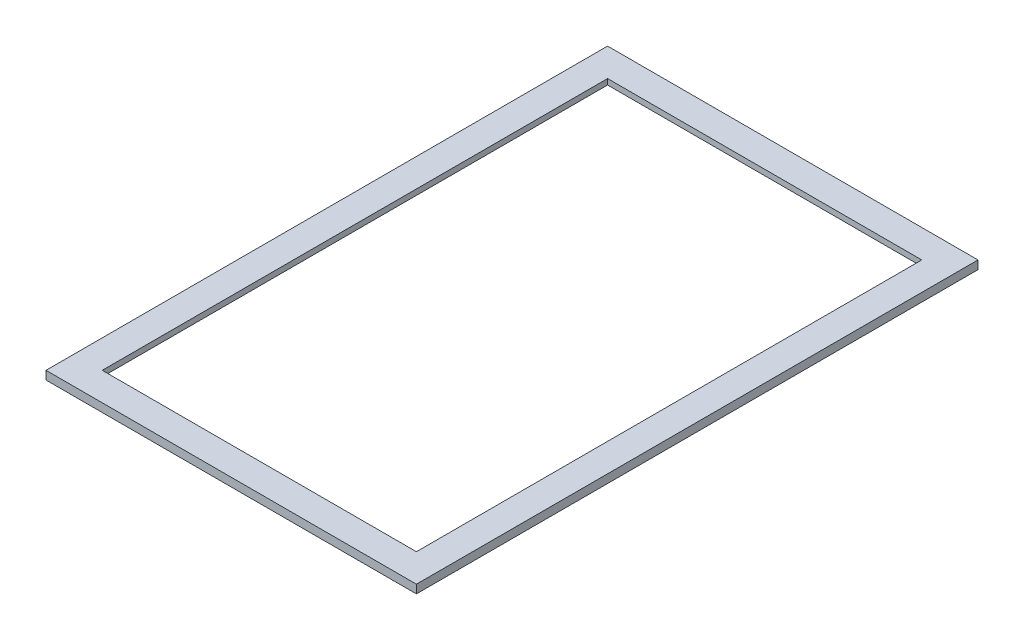
ISO-10303-21;
HEADER;
FILE_DESCRIPTION(('STEP AP214'),'2;1');
FILE_NAME('part.step','',(''),(''),'','','');
FILE_SCHEMA(('AUTOMOTIVE_DESIGN { 1 0 10303 214 1 1 1 1 }'));
ENDSEC;
DATA;
#1=APPLICATION_CONTEXT('core data for automotive mechanical design processes');
#2=APPLICATION_PROTOCOL_DEFINITION('international standard','automotive_design',2000,#1);
#3=PRODUCT_CONTEXT('',#1,'mechanical');
#4=PRODUCT('Part','Part','',(#3));
#5=PRODUCT_RELATED_PRODUCT_CATEGORY('part','',(#4));
#6=PRODUCT_DEFINITION_FORMATION('','',#4);
#7=PRODUCT_DEFINITION_CONTEXT('part definition',#1,'design');
#8=PRODUCT_DEFINITION('design','',#6,#7);
#9=PRODUCT_DEFINITION_SHAPE('','',#8);
#10=(LENGTH_UNIT() NAMED_UNIT(*) SI_UNIT(.MILLI.,.METRE.));
#11=(NAMED_UNIT(*) PLANE_ANGLE_UNIT() SI_UNIT($,.RADIAN.));
#12=(NAMED_UNIT(*) SI_UNIT($,.STERADIAN.) SOLID_ANGLE_UNIT());
#13=UNCERTAINTY_MEASURE_WITH_UNIT(LENGTH_MEASURE(1.E-05),#10,'distance_accuracy_value','');
#14=(GEOMETRIC_REPRESENTATION_CONTEXT(3) GLOBAL_UNCERTAINTY_ASSIGNED_CONTEXT((#13)) GLOBAL_UNIT_ASSIGNED_CONTEXT((#10,
#11,#12)) REPRESENTATION_CONTEXT('',''));
#15=CARTESIAN_POINT('',(0.,0.,0.));
#16=DIRECTION('',(0.,0.,1.));
#17=DIRECTION('',(1.,0.,0.));
#18=AXIS2_PLACEMENT_3D('',#15,#16,#17);
#19=CARTESIAN_POINT('',(65.875,3.,99.875));
#20=DIRECTION('',(-1.,0.,0.));
#21=DIRECTION('',(0.,0.,1.));
#22=AXIS2_PLACEMENT_3D('',#19,#20,#21);
#23=PLANE('',#22);
#24=DIRECTION('',(0.,0.,-1.));
#25=VECTOR('',#24,1.);
#26=CARTESIAN_POINT('',(65.875,0.,99.875));
#27=LINE('',#26,#25);
#28=CARTESIAN_POINT('',(65.875,0.,99.875));
#29=VERTEX_POINT('',#28);
#30=CARTESIAN_POINT('',(65.875,0.,-99.875));
#31=VERTEX_POINT('',#30);
#32=EDGE_CURVE('E187',#29,#31,#27,.T.);
#33=ORIENTED_EDGE('',*,*,#32,.T.);
#34=DIRECTION('',(0.,-1.,0.));
#35=VECTOR('',#34,1.);
#36=CARTESIAN_POINT('',(65.875,3.,-99.875));
#37=LINE('',#36,#35);
#38=CARTESIAN_POINT('',(65.875,3.,-99.875));
#39=VERTEX_POINT('',#38);
#40=EDGE_CURVE('E46',#39,#31,#37,.T.);
#41=ORIENTED_EDGE('',*,*,#40,.F.);
#42=DIRECTION('',(0.,0.,-1.));
#43=VECTOR('',#42,1.);
#44=CARTESIAN_POINT('',(65.875,3.,99.875));
#45=LINE('',#44,#43);
#46=CARTESIAN_POINT('',(65.875,3.,99.875));
#47=VERTEX_POINT('',#46);
#48=EDGE_CURVE('E195',#47,#39,#45,.T.);
#49=ORIENTED_EDGE('',*,*,#48,.F.);
#50=DIRECTION('',(0.,-1.,0.));
#51=VECTOR('',#50,1.);
#52=CARTESIAN_POINT('',(65.875,3.,99.875));
#53=LINE('',#52,#51);
#54=EDGE_CURVE('E204',#47,#29,#53,.T.);
#55=ORIENTED_EDGE('',*,*,#54,.T.);
#56=EDGE_LOOP('',(#33,#41,#49,#55));
#57=FACE_BOUND('',#56,.T.);
#58=ADVANCED_FACE('F39',(#57),#23,.F.);
#59=CARTESIAN_POINT('',(-65.875,3.,-99.875));
#60=DIRECTION('',(0.,0.,1.));
#61=DIRECTION('',(1.,0.,0.));
#62=AXIS2_PLACEMENT_3D('',#59,#60,#61);
#63=PLANE('',#62);
#64=DIRECTION('',(-1.,0.,0.));
#65=VECTOR('',#64,1.);
#66=CARTESIAN_POINT('',(-65.875,0.,-99.875));
#67=LINE('',#66,#65);
#68=CARTESIAN_POINT('',(-65.875,0.,-99.875));
#69=VERTEX_POINT('',#68);
#70=EDGE_CURVE('E201',#31,#69,#67,.T.);
#71=ORIENTED_EDGE('',*,*,#70,.T.);
#72=DIRECTION('',(0.,-1.,0.));
#73=VECTOR('',#72,1.);
#74=CARTESIAN_POINT('',(-65.875,3.,-99.875));
#75=LINE('',#74,#73);
#76=CARTESIAN_POINT('',(-65.875,3.,-99.875));
#77=VERTEX_POINT('',#76);
#78=EDGE_CURVE('E213',#77,#69,#75,.T.);
#79=ORIENTED_EDGE('',*,*,#78,.F.);
#80=DIRECTION('',(-1.,0.,0.));
#81=VECTOR('',#80,1.);
#82=CARTESIAN_POINT('',(-65.875,3.,-99.875));
#83=LINE('',#82,#81);
#84=EDGE_CURVE('E193',#39,#77,#83,.T.);
#85=ORIENTED_EDGE('',*,*,#84,.F.);
#86=ORIENTED_EDGE('',*,*,#40,.T.);
#87=EDGE_LOOP('',(#71,#79,#85,#86));
#88=FACE_BOUND('',#87,.T.);
#89=ADVANCED_FACE('F219',(#88),#63,.F.);
#90=CARTESIAN_POINT('',(-65.875,3.,99.875));
#91=DIRECTION('',(1.,0.,0.));
#92=DIRECTION('',(0.,0.,-1.));
#93=AXIS2_PLACEMENT_3D('',#90,#91,#92);
#94=PLANE('',#93);
#95=DIRECTION('',(0.,0.,1.));
#96=VECTOR('',#95,1.);
#97=CARTESIAN_POINT('',(-65.875,0.,99.875));
#98=LINE('',#97,#96);
#99=CARTESIAN_POINT('',(-65.875,0.,99.875));
#100=VERTEX_POINT('',#99);
#101=EDGE_CURVE('E210',#69,#100,#98,.T.);
#102=ORIENTED_EDGE('',*,*,#101,.T.);
#103=DIRECTION('',(0.,-1.,0.));
#104=VECTOR('',#103,1.);
#105=CARTESIAN_POINT('',(-65.875,3.,99.875));
#106=LINE('',#105,#104);
#107=CARTESIAN_POINT('',(-65.875,3.,99.875));
#108=VERTEX_POINT('',#107);
#109=EDGE_CURVE('E215',#108,#100,#106,.T.);
#110=ORIENTED_EDGE('',*,*,#109,.F.);
#111=DIRECTION('',(0.,0.,1.));
#112=VECTOR('',#111,1.);
#113=CARTESIAN_POINT('',(-65.875,3.,99.875));
#114=LINE('',#113,#112);
#115=EDGE_CURVE('E197',#77,#108,#114,.T.);
#116=ORIENTED_EDGE('',*,*,#115,.F.);
#117=ORIENTED_EDGE('',*,*,#78,.T.);
#118=EDGE_LOOP('',(#102,#110,#116,#117));
#119=FACE_BOUND('',#118,.T.);
#120=ADVANCED_FACE('F235',(#119),#94,.F.);
#121=CARTESIAN_POINT('',(-65.875,3.,99.875));
#122=DIRECTION('',(0.,0.,-1.));
#123=DIRECTION('',(-1.,0.,0.));
#124=AXIS2_PLACEMENT_3D('',#121,#122,#123);
#125=PLANE('',#124);
#126=DIRECTION('',(1.,0.,0.));
#127=VECTOR('',#126,1.);
#128=CARTESIAN_POINT('',(-65.875,0.,99.875));
#129=LINE('',#128,#127);
#130=EDGE_CURVE('E196',#100,#29,#129,.T.);
#131=ORIENTED_EDGE('',*,*,#130,.T.);
#132=ORIENTED_EDGE('',*,*,#54,.F.);
#133=DIRECTION('',(1.,0.,0.));
#134=VECTOR('',#133,1.);
#135=CARTESIAN_POINT('',(-65.875,3.,99.875));
#136=LINE('',#135,#134);
#137=EDGE_CURVE('E199',#108,#47,#136,.T.);
#138=ORIENTED_EDGE('',*,*,#137,.F.);
#139=ORIENTED_EDGE('',*,*,#109,.T.);
#140=EDGE_LOOP('',(#131,#132,#138,#139));
#141=FACE_BOUND('',#140,.T.);
#142=ADVANCED_FACE('F236',(#141),#125,.F.);
#143=CARTESIAN_POINT('',(0.,3.,0.));
#144=DIRECTION('',(0.,-1.,0.));
#145=DIRECTION('',(0.,0.,-1.));
#146=AXIS2_PLACEMENT_3D('',#143,#144,#145);
#147=PLANE('',#146);
#148=DIRECTION('',(-1.,0.,0.));
#149=VECTOR('',#148,1.);
#150=CARTESIAN_POINT('',(-55.875,3.,-89.875));
#151=LINE('',#150,#149);
#152=CARTESIAN_POINT('',(55.875,3.,-89.875));
#153=VERTEX_POINT('',#152);
#154=CARTESIAN_POINT('',(-55.875,3.,-89.875));
#155=VERTEX_POINT('',#154);
#156=EDGE_CURVE('E172',#153,#155,#151,.T.);
#157=ORIENTED_EDGE('',*,*,#156,.F.);
#158=DIRECTION('',(0.,0.,-1.));
#159=VECTOR('',#158,1.);
#160=CARTESIAN_POINT('',(55.875,3.,89.875));
#161=LINE('',#160,#159);
#162=CARTESIAN_POINT('',(55.875,3.,89.875));
#163=VERTEX_POINT('',#162);
#164=EDGE_CURVE('E171',#163,#153,#161,.T.);
#165=ORIENTED_EDGE('',*,*,#164,.F.);
#166=DIRECTION('',(1.,0.,0.));
#167=VECTOR('',#166,1.);
#168=CARTESIAN_POINT('',(-55.875,3.,89.875));
#169=LINE('',#168,#167);
#170=CARTESIAN_POINT('',(-55.875,3.,89.875));
#171=VERTEX_POINT('',#170);
#172=EDGE_CURVE('E179',#171,#163,#169,.T.);
#173=ORIENTED_EDGE('',*,*,#172,.F.);
#174=DIRECTION('',(0.,0.,1.));
#175=VECTOR('',#174,1.);
#176=CARTESIAN_POINT('',(-55.875,3.,89.875));
#177=LINE('',#176,#175);
#178=EDGE_CURVE('E180',#155,#171,#177,.T.);
#179=ORIENTED_EDGE('',*,*,#178,.F.);
#180=EDGE_LOOP('',(#157,#165,#173,#179));
#181=FACE_BOUND('',#180,.T.);
#182=ORIENTED_EDGE('',*,*,#48,.T.);
#183=ORIENTED_EDGE('',*,*,#84,.T.);
#184=ORIENTED_EDGE('',*,*,#115,.T.);
#185=ORIENTED_EDGE('',*,*,#137,.T.);
#186=EDGE_LOOP('',(#182,#183,#184,#185));
#187=FACE_BOUND('',#186,.T.);
#188=ADVANCED_FACE('F238',(#181,#187),#147,.F.);
#189=CARTESIAN_POINT('',(0.,0.,0.));
#190=DIRECTION('',(0.,-1.,0.));
#191=DIRECTION('',(0.,0.,-1.));
#192=AXIS2_PLACEMENT_3D('',#189,#190,#191);
#193=PLANE('',#192);
#194=DIRECTION('',(0.,0.,1.));
#195=VECTOR('',#194,1.);
#196=CARTESIAN_POINT('',(60.875,0.,-94.875));
#197=LINE('',#196,#195);
#198=CARTESIAN_POINT('',(60.875,0.,-94.875));
#199=VERTEX_POINT('',#198);
#200=CARTESIAN_POINT('',(60.875,0.,94.875));
#201=VERTEX_POINT('',#200);
#202=EDGE_CURVE('E52',#199,#201,#197,.T.);
#203=ORIENTED_EDGE('',*,*,#202,.F.);
#204=DIRECTION('',(1.,0.,0.));
#205=VECTOR('',#204,1.);
#206=CARTESIAN_POINT('',(-60.875,0.,-94.875));
#207=LINE('',#206,#205);
#208=CARTESIAN_POINT('',(-60.875,0.,-94.875));
#209=VERTEX_POINT('',#208);
#210=EDGE_CURVE('E147',#209,#199,#207,.T.);
#211=ORIENTED_EDGE('',*,*,#210,.F.);
#212=DIRECTION('',(0.,0.,-1.));
#213=VECTOR('',#212,1.);
#214=CARTESIAN_POINT('',(-60.875,0.,-94.875));
#215=LINE('',#214,#213);
#216=CARTESIAN_POINT('',(-60.875,0.,94.875));
#217=VERTEX_POINT('',#216);
#218=EDGE_CURVE('E146',#217,#209,#215,.T.);
#219=ORIENTED_EDGE('',*,*,#218,.F.);
#220=DIRECTION('',(-1.,0.,0.));
#221=VECTOR('',#220,1.);
#222=CARTESIAN_POINT('',(-60.875,0.,94.875));
#223=LINE('',#222,#221);
#224=EDGE_CURVE('E154',#201,#217,#223,.T.);
#225=ORIENTED_EDGE('',*,*,#224,.F.);
#226=EDGE_LOOP('',(#203,#211,#219,#225));
#227=FACE_BOUND('',#226,.T.);
#228=ORIENTED_EDGE('',*,*,#32,.F.);
#229=ORIENTED_EDGE('',*,*,#130,.F.);
#230=ORIENTED_EDGE('',*,*,#101,.F.);
#231=ORIENTED_EDGE('',*,*,#70,.F.);
#232=EDGE_LOOP('',(#228,#229,#230,#231));
#233=FACE_BOUND('',#232,.T.);
#234=ADVANCED_FACE('F226',(#227,#233),#193,.T.);
#235=CARTESIAN_POINT('',(55.875,-3.,89.875));
#236=DIRECTION('',(1.,0.,0.));
#237=DIRECTION('',(0.,0.,-1.));
#238=AXIS2_PLACEMENT_3D('',#235,#236,#237);
#239=PLANE('',#238);
#240=DIRECTION('',(0.,1.,0.));
#241=VECTOR('',#240,1.);
#242=CARTESIAN_POINT('',(55.875,-3.,-89.875));
#243=LINE('',#242,#241);
#244=CARTESIAN_POINT('',(55.875,1.,-89.875));
#245=VERTEX_POINT('',#244);
#246=EDGE_CURVE('E182',#245,#153,#243,.T.);
#247=ORIENTED_EDGE('',*,*,#246,.F.);
#248=DIRECTION('',(0.,0.,1.));
#249=VECTOR('',#248,1.);
#250=CARTESIAN_POINT('',(55.875,1.,89.875));
#251=LINE('',#250,#249);
#252=CARTESIAN_POINT('',(55.875,1.,89.875));
#253=VERTEX_POINT('',#252);
#254=EDGE_CURVE('E62',#245,#253,#251,.T.);
#255=ORIENTED_EDGE('',*,*,#254,.T.);
#256=DIRECTION('',(0.,1.,0.));
#257=VECTOR('',#256,1.);
#258=CARTESIAN_POINT('',(55.875,-3.,89.875));
#259=LINE('',#258,#257);
#260=EDGE_CURVE('E183',#253,#163,#259,.T.);
#261=ORIENTED_EDGE('',*,*,#260,.T.);
#262=ORIENTED_EDGE('',*,*,#164,.T.);
#263=EDGE_LOOP('',(#247,#255,#261,#262));
#264=FACE_BOUND('',#263,.T.);
#265=ADVANCED_FACE('F246',(#264),#239,.F.);
#266=CARTESIAN_POINT('',(-55.875,-3.,89.875));
#267=DIRECTION('',(0.,0.,1.));
#268=DIRECTION('',(1.,0.,0.));
#269=AXIS2_PLACEMENT_3D('',#266,#267,#268);
#270=PLANE('',#269);
#271=ORIENTED_EDGE('',*,*,#260,.F.);
#272=DIRECTION('',(-1.,0.,0.));
#273=VECTOR('',#272,1.);
#274=CARTESIAN_POINT('',(-55.875,1.,89.875));
#275=LINE('',#274,#273);
#276=CARTESIAN_POINT('',(-55.875,1.,89.875));
#277=VERTEX_POINT('',#276);
#278=EDGE_CURVE('E170',#253,#277,#275,.T.);
#279=ORIENTED_EDGE('',*,*,#278,.T.);
#280=DIRECTION('',(0.,1.,0.));
#281=VECTOR('',#280,1.);
#282=CARTESIAN_POINT('',(-55.875,-3.,89.875));
#283=LINE('',#282,#281);
#284=EDGE_CURVE('E190',#277,#171,#283,.T.);
#285=ORIENTED_EDGE('',*,*,#284,.T.);
#286=ORIENTED_EDGE('',*,*,#172,.T.);
#287=EDGE_LOOP('',(#271,#279,#285,#286));
#288=FACE_BOUND('',#287,.T.);
#289=ADVANCED_FACE('F289',(#288),#270,.F.);
#290=CARTESIAN_POINT('',(-55.875,-3.,89.875));
#291=DIRECTION('',(-1.,0.,0.));
#292=DIRECTION('',(0.,0.,1.));
#293=AXIS2_PLACEMENT_3D('',#290,#291,#292);
#294=PLANE('',#293);
#295=ORIENTED_EDGE('',*,*,#284,.F.);
#296=DIRECTION('',(0.,0.,-1.));
#297=VECTOR('',#296,1.);
#298=CARTESIAN_POINT('',(-55.875,1.,89.875));
#299=LINE('',#298,#297);
#300=CARTESIAN_POINT('',(-55.875,1.,-89.875));
#301=VERTEX_POINT('',#300);
#302=EDGE_CURVE('E163',#277,#301,#299,.T.);
#303=ORIENTED_EDGE('',*,*,#302,.T.);
#304=DIRECTION('',(0.,1.,0.));
#305=VECTOR('',#304,1.);
#306=CARTESIAN_POINT('',(-55.875,-3.,-89.875));
#307=LINE('',#306,#305);
#308=EDGE_CURVE('E186',#301,#155,#307,.T.);
#309=ORIENTED_EDGE('',*,*,#308,.T.);
#310=ORIENTED_EDGE('',*,*,#178,.T.);
#311=EDGE_LOOP('',(#295,#303,#309,#310));
#312=FACE_BOUND('',#311,.T.);
#313=ADVANCED_FACE('F298',(#312),#294,.F.);
#314=CARTESIAN_POINT('',(-55.875,-3.,-89.875));
#315=DIRECTION('',(0.,0.,-1.));
#316=DIRECTION('',(-1.,0.,0.));
#317=AXIS2_PLACEMENT_3D('',#314,#315,#316);
#318=PLANE('',#317);
#319=ORIENTED_EDGE('',*,*,#308,.F.);
#320=DIRECTION('',(1.,0.,0.));
#321=VECTOR('',#320,1.);
#322=CARTESIAN_POINT('',(-55.875,1.,-89.875));
#323=LINE('',#322,#321);
#324=EDGE_CURVE('E11',#301,#245,#323,.T.);
#325=ORIENTED_EDGE('',*,*,#324,.T.);
#326=ORIENTED_EDGE('',*,*,#246,.T.);
#327=ORIENTED_EDGE('',*,*,#156,.T.);
#328=EDGE_LOOP('',(#319,#325,#326,#327));
#329=FACE_BOUND('',#328,.T.);
#330=ADVANCED_FACE('F306',(#329),#318,.F.);
#331=CARTESIAN_POINT('',(0.,1.,0.));
#332=DIRECTION('',(0.,1.,0.));
#333=DIRECTION('',(0.,0.,1.));
#334=AXIS2_PLACEMENT_3D('',#331,#332,#333);
#335=PLANE('',#334);
#336=DIRECTION('',(0.,0.,1.));
#337=VECTOR('',#336,1.);
#338=CARTESIAN_POINT('',(60.875,1.,-94.875));
#339=LINE('',#338,#337);
#340=CARTESIAN_POINT('',(60.875,1.,-94.875));
#341=VERTEX_POINT('',#340);
#342=CARTESIAN_POINT('',(60.875,1.,94.875));
#343=VERTEX_POINT('',#342);
#344=EDGE_CURVE('E129',#341,#343,#339,.T.);
#345=ORIENTED_EDGE('',*,*,#344,.T.);
#346=DIRECTION('',(-1.,0.,0.));
#347=VECTOR('',#346,1.);
#348=CARTESIAN_POINT('',(-60.875,1.,94.875));
#349=LINE('',#348,#347);
#350=CARTESIAN_POINT('',(-60.875,1.,94.875));
#351=VERTEX_POINT('',#350);
#352=EDGE_CURVE('E139',#343,#351,#349,.T.);
#353=ORIENTED_EDGE('',*,*,#352,.T.);
#354=DIRECTION('',(0.,0.,-1.));
#355=VECTOR('',#354,1.);
#356=CARTESIAN_POINT('',(-60.875,1.,-94.875));
#357=LINE('',#356,#355);
#358=CARTESIAN_POINT('',(-60.875,1.,-94.875));
#359=VERTEX_POINT('',#358);
#360=EDGE_CURVE('E145',#351,#359,#357,.T.);
#361=ORIENTED_EDGE('',*,*,#360,.T.);
#362=DIRECTION('',(1.,0.,0.));
#363=VECTOR('',#362,1.);
#364=CARTESIAN_POINT('',(-60.875,1.,-94.875));
#365=LINE('',#364,#363);
#366=EDGE_CURVE('E133',#359,#341,#365,.T.);
#367=ORIENTED_EDGE('',*,*,#366,.T.);
#368=EDGE_LOOP('',(#345,#353,#361,#367));
#369=FACE_BOUND('',#368,.T.);
#370=ORIENTED_EDGE('',*,*,#324,.F.);
#371=ORIENTED_EDGE('',*,*,#302,.F.);
#372=ORIENTED_EDGE('',*,*,#278,.F.);
#373=ORIENTED_EDGE('',*,*,#254,.F.);
#374=EDGE_LOOP('',(#370,#371,#372,#373));
#375=FACE_BOUND('',#374,.T.);
#376=ADVANCED_FACE('F144',(#369,#375),#335,.F.);
#377=CARTESIAN_POINT('',(60.875,1.,-94.875));
#378=DIRECTION('',(1.,0.,0.));
#379=DIRECTION('',(0.,0.,-1.));
#380=AXIS2_PLACEMENT_3D('',#377,#378,#379);
#381=PLANE('',#380);
#382=ORIENTED_EDGE('',*,*,#202,.T.);
#383=DIRECTION('',(0.,-1.,0.));
#384=VECTOR('',#383,1.);
#385=CARTESIAN_POINT('',(60.875,1.,94.875));
#386=LINE('',#385,#384);
#387=EDGE_CURVE('E121',#343,#201,#386,.T.);
#388=ORIENTED_EDGE('',*,*,#387,.F.);
#389=ORIENTED_EDGE('',*,*,#344,.F.);
#390=DIRECTION('',(0.,-1.,0.));
#391=VECTOR('',#390,1.);
#392=CARTESIAN_POINT('',(60.875,1.,-94.875));
#393=LINE('',#392,#391);
#394=EDGE_CURVE('E160',#341,#199,#393,.T.);
#395=ORIENTED_EDGE('',*,*,#394,.T.);
#396=EDGE_LOOP('',(#382,#388,#389,#395));
#397=FACE_BOUND('',#396,.T.);
#398=ADVANCED_FACE('F127',(#397),#381,.F.);
#399=CARTESIAN_POINT('',(-60.875,1.,-94.875));
#400=DIRECTION('',(0.,0.,-1.));
#401=DIRECTION('',(-1.,0.,0.));
#402=AXIS2_PLACEMENT_3D('',#399,#400,#401);
#403=PLANE('',#402);
#404=ORIENTED_EDGE('',*,*,#210,.T.);
#405=ORIENTED_EDGE('',*,*,#394,.F.);
#406=ORIENTED_EDGE('',*,*,#366,.F.);
#407=DIRECTION('',(0.,-1.,0.));
#408=VECTOR('',#407,1.);
#409=CARTESIAN_POINT('',(-60.875,1.,-94.875));
#410=LINE('',#409,#408);
#411=EDGE_CURVE('E162',#359,#209,#410,.T.);
#412=ORIENTED_EDGE('',*,*,#411,.T.);
#413=EDGE_LOOP('',(#404,#405,#406,#412));
#414=FACE_BOUND('',#413,.T.);
#415=ADVANCED_FACE('F332',(#414),#403,.F.);
#416=CARTESIAN_POINT('',(-60.875,1.,-94.875));
#417=DIRECTION('',(-1.,0.,0.));
#418=DIRECTION('',(0.,0.,1.));
#419=AXIS2_PLACEMENT_3D('',#416,#417,#418);
#420=PLANE('',#419);
#421=ORIENTED_EDGE('',*,*,#218,.T.);
#422=ORIENTED_EDGE('',*,*,#411,.F.);
#423=ORIENTED_EDGE('',*,*,#360,.F.);
#424=DIRECTION('',(0.,-1.,0.));
#425=VECTOR('',#424,1.);
#426=CARTESIAN_POINT('',(-60.875,1.,94.875));
#427=LINE('',#426,#425);
#428=EDGE_CURVE('E132',#351,#217,#427,.T.);
#429=ORIENTED_EDGE('',*,*,#428,.T.);
#430=EDGE_LOOP('',(#421,#422,#423,#429));
#431=FACE_BOUND('',#430,.T.);
#432=ADVANCED_FACE('F345',(#431),#420,.F.);
#433=CARTESIAN_POINT('',(-60.875,1.,94.875));
#434=DIRECTION('',(0.,0.,1.));
#435=DIRECTION('',(1.,0.,0.));
#436=AXIS2_PLACEMENT_3D('',#433,#434,#435);
#437=PLANE('',#436);
#438=ORIENTED_EDGE('',*,*,#224,.T.);
#439=ORIENTED_EDGE('',*,*,#428,.F.);
#440=ORIENTED_EDGE('',*,*,#352,.F.);
#441=ORIENTED_EDGE('',*,*,#387,.T.);
#442=EDGE_LOOP('',(#438,#439,#440,#441));
#443=FACE_BOUND('',#442,.T.);
#444=ADVANCED_FACE('F137',(#443),#437,.F.);
#445=CLOSED_SHELL('',(#58,#89,#120,#142,#188,#234,#265,#289,#313,#330,#376,#398,#415,#432,#444));
#446=MANIFOLD_SOLID_BREP('B2',#445);
#447=ADVANCED_BREP_SHAPE_REPRESENTATION('',(#18,#446),#14);
#448=SHAPE_DEFINITION_REPRESENTATION(#9,#447);
ENDSEC;
END-ISO-10303-21;
